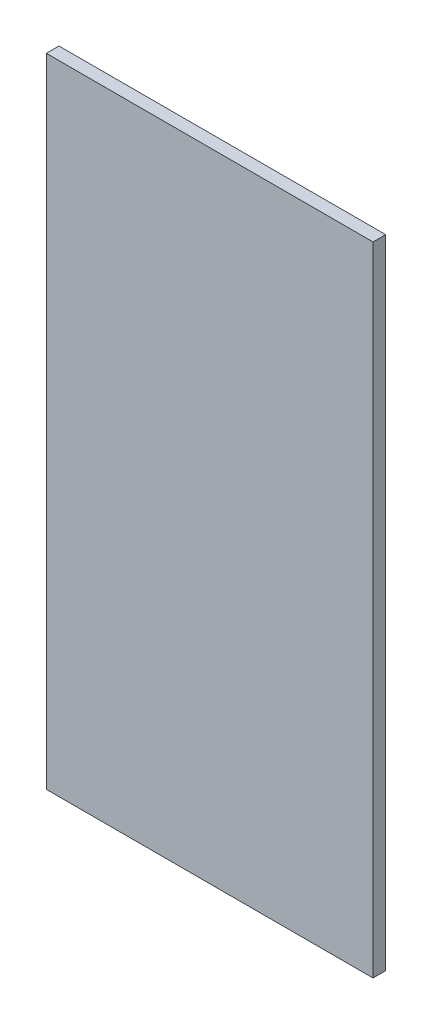
ISO-10303-21;
HEADER;
FILE_DESCRIPTION(('STEP AP214'),'2;1');
FILE_NAME('part.step','',(''),(''),'','','');
FILE_SCHEMA(('AUTOMOTIVE_DESIGN { 1 0 10303 214 1 1 1 1 }'));
ENDSEC;
DATA;
#1=APPLICATION_CONTEXT('core data for automotive mechanical design processes');
#2=APPLICATION_PROTOCOL_DEFINITION('international standard','automotive_design',2000,#1);
#3=PRODUCT_CONTEXT('',#1,'mechanical');
#4=PRODUCT('Part','Part','',(#3));
#5=PRODUCT_RELATED_PRODUCT_CATEGORY('part','',(#4));
#6=PRODUCT_DEFINITION_FORMATION('','',#4);
#7=PRODUCT_DEFINITION_CONTEXT('part definition',#1,'design');
#8=PRODUCT_DEFINITION('design','',#6,#7);
#9=PRODUCT_DEFINITION_SHAPE('','',#8);
#10=(LENGTH_UNIT() NAMED_UNIT(*) SI_UNIT(.MILLI.,.METRE.));
#11=(NAMED_UNIT(*) PLANE_ANGLE_UNIT() SI_UNIT($,.RADIAN.));
#12=(NAMED_UNIT(*) SI_UNIT($,.STERADIAN.) SOLID_ANGLE_UNIT());
#13=UNCERTAINTY_MEASURE_WITH_UNIT(LENGTH_MEASURE(1.E-05),#10,'distance_accuracy_value','');
#14=(GEOMETRIC_REPRESENTATION_CONTEXT(3) GLOBAL_UNCERTAINTY_ASSIGNED_CONTEXT((#13)) GLOBAL_UNIT_ASSIGNED_CONTEXT((#10,
#11,#12)) REPRESENTATION_CONTEXT('',''));
#15=CARTESIAN_POINT('',(0.,0.,0.));
#16=DIRECTION('',(0.,0.,1.));
#17=DIRECTION('',(1.,0.,0.));
#18=AXIS2_PLACEMENT_3D('',#15,#16,#17);
#19=CARTESIAN_POINT('',(0.,0.,3.175));
#20=DIRECTION('',(1.,0.,0.));
#21=DIRECTION('',(0.,0.,-1.));
#22=AXIS2_PLACEMENT_3D('',#19,#20,#21);
#23=PLANE('',#22);
#24=DIRECTION('',(0.,-1.,0.));
#25=VECTOR('',#24,1.);
#26=CARTESIAN_POINT('',(0.,0.,0.));
#27=LINE('',#26,#25);
#28=CARTESIAN_POINT('',(0.,160.,0.));
#29=VERTEX_POINT('',#28);
#30=CARTESIAN_POINT('',(0.,0.,0.));
#31=VERTEX_POINT('',#30);
#32=EDGE_CURVE('E97',#29,#31,#27,.T.);
#33=ORIENTED_EDGE('',*,*,#32,.T.);
#34=DIRECTION('',(0.,0.,-1.));
#35=VECTOR('',#34,1.);
#36=CARTESIAN_POINT('',(0.,0.,3.175));
#37=LINE('',#36,#35);
#38=CARTESIAN_POINT('',(0.,0.,3.175));
#39=VERTEX_POINT('',#38);
#40=EDGE_CURVE('E11',#39,#31,#37,.T.);
#41=ORIENTED_EDGE('',*,*,#40,.F.);
#42=DIRECTION('',(0.,-1.,0.));
#43=VECTOR('',#42,1.);
#44=CARTESIAN_POINT('',(0.,0.,3.175));
#45=LINE('',#44,#43);
#46=CARTESIAN_POINT('',(0.,160.,3.175));
#47=VERTEX_POINT('',#46);
#48=EDGE_CURVE('E85',#47,#39,#45,.T.);
#49=ORIENTED_EDGE('',*,*,#48,.F.);
#50=DIRECTION('',(0.,0.,-1.));
#51=VECTOR('',#50,1.);
#52=CARTESIAN_POINT('',(0.,160.,3.175));
#53=LINE('',#52,#51);
#54=EDGE_CURVE('E93',#47,#29,#53,.T.);
#55=ORIENTED_EDGE('',*,*,#54,.T.);
#56=EDGE_LOOP('',(#33,#41,#49,#55));
#57=FACE_BOUND('',#56,.T.);
#58=ADVANCED_FACE('F34',(#57),#23,.F.);
#59=CARTESIAN_POINT('',(0.,0.,3.175));
#60=DIRECTION('',(0.,1.,0.));
#61=DIRECTION('',(0.,0.,1.));
#62=AXIS2_PLACEMENT_3D('',#59,#60,#61);
#63=PLANE('',#62);
#64=DIRECTION('',(1.,0.,0.));
#65=VECTOR('',#64,1.);
#66=CARTESIAN_POINT('',(0.,0.,0.));
#67=LINE('',#66,#65);
#68=CARTESIAN_POINT('',(82.,0.,0.));
#69=VERTEX_POINT('',#68);
#70=EDGE_CURVE('E89',#31,#69,#67,.T.);
#71=ORIENTED_EDGE('',*,*,#70,.T.);
#72=DIRECTION('',(0.,0.,-1.));
#73=VECTOR('',#72,1.);
#74=CARTESIAN_POINT('',(82.,0.,3.175));
#75=LINE('',#74,#73);
#76=CARTESIAN_POINT('',(82.,0.,3.175));
#77=VERTEX_POINT('',#76);
#78=EDGE_CURVE('E42',#77,#69,#75,.T.);
#79=ORIENTED_EDGE('',*,*,#78,.F.);
#80=DIRECTION('',(1.,0.,0.));
#81=VECTOR('',#80,1.);
#82=CARTESIAN_POINT('',(0.,0.,3.175));
#83=LINE('',#82,#81);
#84=EDGE_CURVE('E80',#39,#77,#83,.T.);
#85=ORIENTED_EDGE('',*,*,#84,.F.);
#86=ORIENTED_EDGE('',*,*,#40,.T.);
#87=EDGE_LOOP('',(#71,#79,#85,#86));
#88=FACE_BOUND('',#87,.T.);
#89=ADVANCED_FACE('F88',(#88),#63,.F.);
#90=CARTESIAN_POINT('',(82.,0.,3.175));
#91=DIRECTION('',(-1.,0.,0.));
#92=DIRECTION('',(0.,0.,1.));
#93=AXIS2_PLACEMENT_3D('',#90,#91,#92);
#94=PLANE('',#93);
#95=DIRECTION('',(0.,1.,0.));
#96=VECTOR('',#95,1.);
#97=CARTESIAN_POINT('',(82.,0.,0.));
#98=LINE('',#97,#96);
#99=CARTESIAN_POINT('',(82.,160.,0.));
#100=VERTEX_POINT('',#99);
#101=EDGE_CURVE('E67',#69,#100,#98,.T.);
#102=ORIENTED_EDGE('',*,*,#101,.T.);
#103=DIRECTION('',(0.,0.,-1.));
#104=VECTOR('',#103,1.);
#105=CARTESIAN_POINT('',(82.,160.,3.175));
#106=LINE('',#105,#104);
#107=CARTESIAN_POINT('',(82.,160.,3.175));
#108=VERTEX_POINT('',#107);
#109=EDGE_CURVE('E90',#108,#100,#106,.T.);
#110=ORIENTED_EDGE('',*,*,#109,.F.);
#111=DIRECTION('',(0.,1.,0.));
#112=VECTOR('',#111,1.);
#113=CARTESIAN_POINT('',(82.,0.,3.175));
#114=LINE('',#113,#112);
#115=EDGE_CURVE('E83',#77,#108,#114,.T.);
#116=ORIENTED_EDGE('',*,*,#115,.F.);
#117=ORIENTED_EDGE('',*,*,#78,.T.);
#118=EDGE_LOOP('',(#102,#110,#116,#117));
#119=FACE_BOUND('',#118,.T.);
#120=ADVANCED_FACE('F91',(#119),#94,.F.);
#121=CARTESIAN_POINT('',(0.,160.,3.175));
#122=DIRECTION('',(0.,-1.,0.));
#123=DIRECTION('',(0.,0.,-1.));
#124=AXIS2_PLACEMENT_3D('',#121,#122,#123);
#125=PLANE('',#124);
#126=DIRECTION('',(-1.,0.,0.));
#127=VECTOR('',#126,1.);
#128=CARTESIAN_POINT('',(0.,160.,0.));
#129=LINE('',#128,#127);
#130=EDGE_CURVE('E73',#100,#29,#129,.T.);
#131=ORIENTED_EDGE('',*,*,#130,.T.);
#132=ORIENTED_EDGE('',*,*,#54,.F.);
#133=DIRECTION('',(-1.,0.,0.));
#134=VECTOR('',#133,1.);
#135=CARTESIAN_POINT('',(0.,160.,3.175));
#136=LINE('',#135,#134);
#137=EDGE_CURVE('E50',#108,#47,#136,.T.);
#138=ORIENTED_EDGE('',*,*,#137,.F.);
#139=ORIENTED_EDGE('',*,*,#109,.T.);
#140=EDGE_LOOP('',(#131,#132,#138,#139));
#141=FACE_BOUND('',#140,.T.);
#142=ADVANCED_FACE('F104',(#141),#125,.F.);
#143=CARTESIAN_POINT('',(0.,0.,3.175));
#144=DIRECTION('',(0.,0.,-1.));
#145=DIRECTION('',(-1.,0.,0.));
#146=AXIS2_PLACEMENT_3D('',#143,#144,#145);
#147=PLANE('',#146);
#148=ORIENTED_EDGE('',*,*,#48,.T.);
#149=ORIENTED_EDGE('',*,*,#84,.T.);
#150=ORIENTED_EDGE('',*,*,#115,.T.);
#151=ORIENTED_EDGE('',*,*,#137,.T.);
#152=EDGE_LOOP('',(#148,#149,#150,#151));
#153=FACE_BOUND('',#152,.T.);
#154=ADVANCED_FACE('F81',(#153),#147,.F.);
#155=CARTESIAN_POINT('',(0.,0.,0.));
#156=DIRECTION('',(0.,0.,-1.));
#157=DIRECTION('',(-1.,0.,0.));
#158=AXIS2_PLACEMENT_3D('',#155,#156,#157);
#159=PLANE('',#158);
#160=ORIENTED_EDGE('',*,*,#32,.F.);
#161=ORIENTED_EDGE('',*,*,#130,.F.);
#162=ORIENTED_EDGE('',*,*,#101,.F.);
#163=ORIENTED_EDGE('',*,*,#70,.F.);
#164=EDGE_LOOP('',(#160,#161,#162,#163));
#165=FACE_BOUND('',#164,.T.);
#166=ADVANCED_FACE('F107',(#165),#159,.T.);
#167=CLOSED_SHELL('',(#58,#89,#120,#142,#154,#166));
#168=MANIFOLD_SOLID_BREP('B2',#167);
#169=ADVANCED_BREP_SHAPE_REPRESENTATION('',(#18,#168),#14);
#170=SHAPE_DEFINITION_REPRESENTATION(#9,#169);
ENDSEC;
END-ISO-10303-21;
